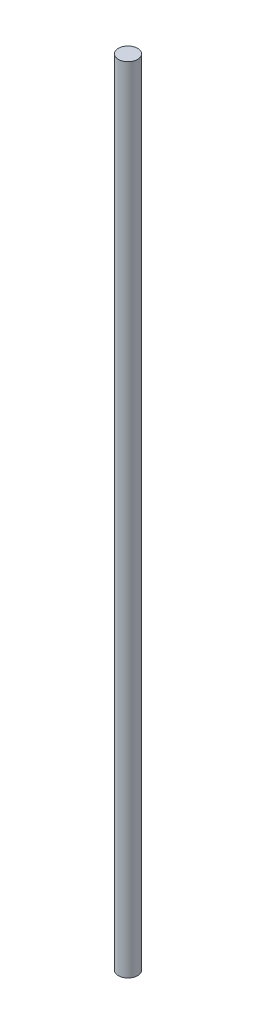
ISO-10303-21;
HEADER;
FILE_DESCRIPTION(('STEP AP214'),'2;1');
FILE_NAME('part.step','',(''),(''),'','','');
FILE_SCHEMA(('AUTOMOTIVE_DESIGN { 1 0 10303 214 1 1 1 1 }'));
ENDSEC;
DATA;
#1=APPLICATION_CONTEXT('core data for automotive mechanical design processes');
#2=APPLICATION_PROTOCOL_DEFINITION('international standard','automotive_design',2000,#1);
#3=PRODUCT_CONTEXT('',#1,'mechanical');
#4=PRODUCT('Part','Part','',(#3));
#5=PRODUCT_RELATED_PRODUCT_CATEGORY('part','',(#4));
#6=PRODUCT_DEFINITION_FORMATION('','',#4);
#7=PRODUCT_DEFINITION_CONTEXT('part definition',#1,'design');
#8=PRODUCT_DEFINITION('design','',#6,#7);
#9=PRODUCT_DEFINITION_SHAPE('','',#8);
#10=(LENGTH_UNIT() NAMED_UNIT(*) SI_UNIT(.MILLI.,.METRE.));
#11=(NAMED_UNIT(*) PLANE_ANGLE_UNIT() SI_UNIT($,.RADIAN.));
#12=(NAMED_UNIT(*) SI_UNIT($,.STERADIAN.) SOLID_ANGLE_UNIT());
#13=UNCERTAINTY_MEASURE_WITH_UNIT(LENGTH_MEASURE(1.E-05),#10,'distance_accuracy_value','');
#14=(GEOMETRIC_REPRESENTATION_CONTEXT(3) GLOBAL_UNCERTAINTY_ASSIGNED_CONTEXT((#13)) GLOBAL_UNIT_ASSIGNED_CONTEXT((#10,
#11,#12)) REPRESENTATION_CONTEXT('',''));
#15=CARTESIAN_POINT('',(0.,0.,0.));
#16=DIRECTION('',(0.,0.,1.));
#17=DIRECTION('',(1.,0.,0.));
#18=AXIS2_PLACEMENT_3D('',#15,#16,#17);
#19=CARTESIAN_POINT('',(0.,165.,0.));
#20=DIRECTION('',(0.,-1.,0.));
#21=DIRECTION('',(0.,0.,-1.));
#22=AXIS2_PLACEMENT_3D('',#19,#20,#21);
#23=CYLINDRICAL_SURFACE('',#22,4.);
#24=CARTESIAN_POINT('',(0.,165.,0.));
#25=DIRECTION('',(0.,1.,0.));
#26=DIRECTION('',(0.,0.,1.));
#27=AXIS2_PLACEMENT_3D('',#24,#25,#26);
#28=CIRCLE('',#27,4.);
#29=CARTESIAN_POINT('',(0.,165.,4.));
#30=VERTEX_POINT('',#29);
#31=EDGE_CURVE('E10',#30,#30,#28,.T.);
#32=ORIENTED_EDGE('',*,*,#31,.F.);
#33=EDGE_LOOP('',(#32));
#34=FACE_BOUND('',#33,.T.);
#35=CARTESIAN_POINT('',(0.,-165.,0.));
#36=DIRECTION('',(0.,1.,0.));
#37=DIRECTION('',(0.,0.,1.));
#38=AXIS2_PLACEMENT_3D('',#35,#36,#37);
#39=CIRCLE('',#38,4.);
#40=CARTESIAN_POINT('',(0.,-165.,4.));
#41=VERTEX_POINT('',#40);
#42=EDGE_CURVE('E33',#41,#41,#39,.T.);
#43=ORIENTED_EDGE('',*,*,#42,.T.);
#44=EDGE_LOOP('',(#43));
#45=FACE_BOUND('',#44,.T.);
#46=ADVANCED_FACE('F30',(#34,#45),#23,.T.);
#47=CARTESIAN_POINT('',(0.,165.,0.));
#48=DIRECTION('',(0.,1.,0.));
#49=DIRECTION('',(0.,0.,1.));
#50=AXIS2_PLACEMENT_3D('',#47,#48,#49);
#51=PLANE('',#50);
#52=ORIENTED_EDGE('',*,*,#31,.T.);
#53=EDGE_LOOP('',(#52));
#54=FACE_BOUND('',#53,.T.);
#55=ADVANCED_FACE('F45',(#54),#51,.T.);
#56=CARTESIAN_POINT('',(0.,-165.,0.));
#57=DIRECTION('',(0.,1.,0.));
#58=DIRECTION('',(0.,0.,1.));
#59=AXIS2_PLACEMENT_3D('',#56,#57,#58);
#60=PLANE('',#59);
#61=ORIENTED_EDGE('',*,*,#42,.F.);
#62=EDGE_LOOP('',(#61));
#63=FACE_BOUND('',#62,.T.);
#64=ADVANCED_FACE('F43',(#63),#60,.F.);
#65=CLOSED_SHELL('',(#46,#55,#64));
#66=MANIFOLD_SOLID_BREP('B2',#65);
#67=ADVANCED_BREP_SHAPE_REPRESENTATION('',(#18,#66),#14);
#68=SHAPE_DEFINITION_REPRESENTATION(#9,#67);
ENDSEC;
END-ISO-10303-21;
